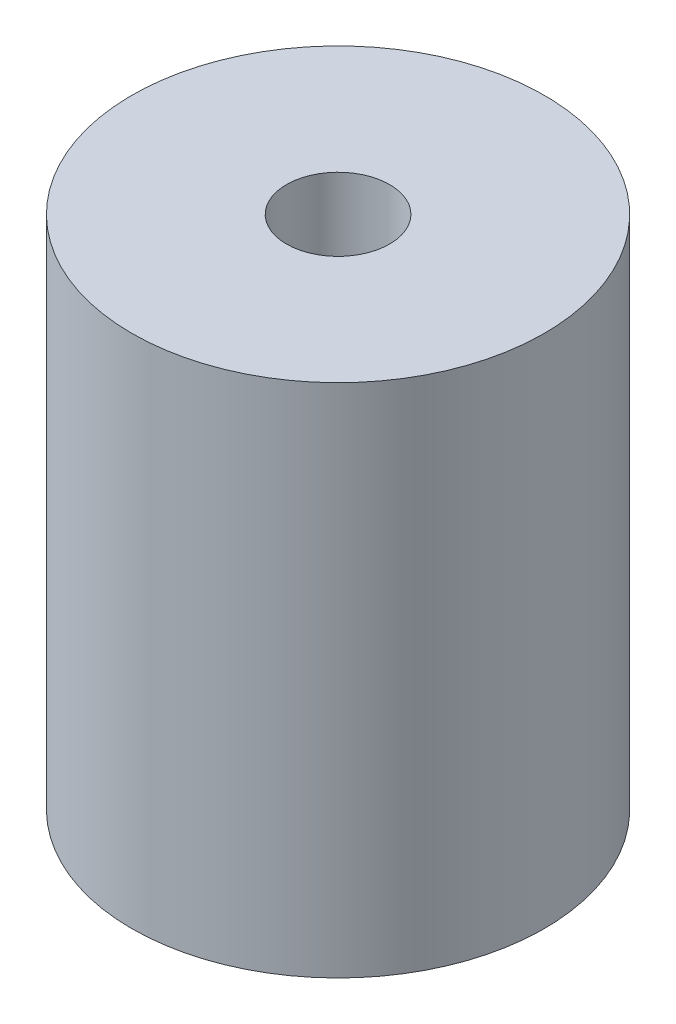
ISO-10303-21;
HEADER;
FILE_DESCRIPTION(('STEP AP214'),'2;1');
FILE_NAME('part.step','',(''),(''),'','','');
FILE_SCHEMA(('AUTOMOTIVE_DESIGN { 1 0 10303 214 1 1 1 1 }'));
ENDSEC;
DATA;
#1=APPLICATION_CONTEXT('core data for automotive mechanical design processes');
#2=APPLICATION_PROTOCOL_DEFINITION('international standard','automotive_design',2000,#1);
#3=PRODUCT_CONTEXT('',#1,'mechanical');
#4=PRODUCT('Part','Part','',(#3));
#5=PRODUCT_RELATED_PRODUCT_CATEGORY('part','',(#4));
#6=PRODUCT_DEFINITION_FORMATION('','',#4);
#7=PRODUCT_DEFINITION_CONTEXT('part definition',#1,'design');
#8=PRODUCT_DEFINITION('design','',#6,#7);
#9=PRODUCT_DEFINITION_SHAPE('','',#8);
#10=(LENGTH_UNIT() NAMED_UNIT(*) SI_UNIT(.MILLI.,.METRE.));
#11=(NAMED_UNIT(*) PLANE_ANGLE_UNIT() SI_UNIT($,.RADIAN.));
#12=(NAMED_UNIT(*) SI_UNIT($,.STERADIAN.) SOLID_ANGLE_UNIT());
#13=UNCERTAINTY_MEASURE_WITH_UNIT(LENGTH_MEASURE(1.E-05),#10,'distance_accuracy_value','');
#14=(GEOMETRIC_REPRESENTATION_CONTEXT(3) GLOBAL_UNCERTAINTY_ASSIGNED_CONTEXT((#13)) GLOBAL_UNIT_ASSIGNED_CONTEXT((#10,
#11,#12)) REPRESENTATION_CONTEXT('',''));
#15=CARTESIAN_POINT('',(0.,0.,0.));
#16=DIRECTION('',(0.,0.,1.));
#17=DIRECTION('',(1.,0.,0.));
#18=AXIS2_PLACEMENT_3D('',#15,#16,#17);
#19=CARTESIAN_POINT('',(0.,12.5,0.));
#20=DIRECTION('',(0.,-1.,0.));
#21=DIRECTION('',(0.,0.,-1.));
#22=AXIS2_PLACEMENT_3D('',#19,#20,#21);
#23=CYLINDRICAL_SURFACE('',#22,10.);
#24=CARTESIAN_POINT('',(0.,12.5,0.));
#25=DIRECTION('',(0.,1.,0.));
#26=DIRECTION('',(0.,0.,1.));
#27=AXIS2_PLACEMENT_3D('',#24,#25,#26);
#28=CIRCLE('',#27,10.);
#29=CARTESIAN_POINT('',(0.,12.5,10.));
#30=VERTEX_POINT('',#29);
#31=EDGE_CURVE('E10',#30,#30,#28,.T.);
#32=ORIENTED_EDGE('',*,*,#31,.F.);
#33=EDGE_LOOP('',(#32));
#34=FACE_BOUND('',#33,.T.);
#35=CARTESIAN_POINT('',(0.,-12.5,0.));
#36=DIRECTION('',(0.,1.,0.));
#37=DIRECTION('',(0.,0.,1.));
#38=AXIS2_PLACEMENT_3D('',#35,#36,#37);
#39=CIRCLE('',#38,10.);
#40=CARTESIAN_POINT('',(0.,-12.5,10.));
#41=VERTEX_POINT('',#40);
#42=EDGE_CURVE('E46',#41,#41,#39,.T.);
#43=ORIENTED_EDGE('',*,*,#42,.T.);
#44=EDGE_LOOP('',(#43));
#45=FACE_BOUND('',#44,.T.);
#46=ADVANCED_FACE('F43',(#34,#45),#23,.T.);
#47=CARTESIAN_POINT('',(0.,12.5,0.));
#48=DIRECTION('',(0.,1.,0.));
#49=DIRECTION('',(0.,0.,1.));
#50=AXIS2_PLACEMENT_3D('',#47,#48,#49);
#51=PLANE('',#50);
#52=CARTESIAN_POINT('',(0.,12.5,0.));
#53=DIRECTION('',(0.,1.,0.));
#54=DIRECTION('',(0.,0.,1.));
#55=AXIS2_PLACEMENT_3D('',#52,#53,#54);
#56=CIRCLE('',#55,2.5);
#57=CARTESIAN_POINT('',(0.,12.5,2.5));
#58=VERTEX_POINT('',#57);
#59=EDGE_CURVE('E55',#58,#58,#56,.T.);
#60=ORIENTED_EDGE('',*,*,#59,.F.);
#61=EDGE_LOOP('',(#60));
#62=FACE_BOUND('',#61,.T.);
#63=ORIENTED_EDGE('',*,*,#31,.T.);
#64=EDGE_LOOP('',(#63));
#65=FACE_BOUND('',#64,.T.);
#66=ADVANCED_FACE('F80',(#62,#65),#51,.T.);
#67=CARTESIAN_POINT('',(0.,-12.5,0.));
#68=DIRECTION('',(0.,1.,0.));
#69=DIRECTION('',(0.,0.,1.));
#70=AXIS2_PLACEMENT_3D('',#67,#68,#69);
#71=PLANE('',#70);
#72=CARTESIAN_POINT('',(0.,-12.5,0.));
#73=DIRECTION('',(0.,-1.,0.));
#74=DIRECTION('',(0.,0.,-1.));
#75=AXIS2_PLACEMENT_3D('',#72,#73,#74);
#76=CIRCLE('',#75,4.);
#77=CARTESIAN_POINT('',(0.,-12.5,-4.));
#78=VERTEX_POINT('',#77);
#79=EDGE_CURVE('E68',#78,#78,#76,.T.);
#80=ORIENTED_EDGE('',*,*,#79,.F.);
#81=EDGE_LOOP('',(#80));
#82=FACE_BOUND('',#81,.T.);
#83=ORIENTED_EDGE('',*,*,#42,.F.);
#84=EDGE_LOOP('',(#83));
#85=FACE_BOUND('',#84,.T.);
#86=ADVANCED_FACE('F76',(#82,#85),#71,.F.);
#87=CARTESIAN_POINT('',(0.,12.5,0.));
#88=DIRECTION('',(0.,-1.,0.));
#89=DIRECTION('',(0.,0.,-1.));
#90=AXIS2_PLACEMENT_3D('',#87,#88,#89);
#91=CYLINDRICAL_SURFACE('',#90,2.5);
#92=ORIENTED_EDGE('',*,*,#59,.T.);
#93=EDGE_LOOP('',(#92));
#94=FACE_BOUND('',#93,.T.);
#95=CARTESIAN_POINT('',(0.,0.,0.));
#96=DIRECTION('',(0.,1.,0.));
#97=DIRECTION('',(0.,0.,1.));
#98=AXIS2_PLACEMENT_3D('',#95,#96,#97);
#99=CIRCLE('',#98,2.5);
#100=CARTESIAN_POINT('',(0.,0.,2.5));
#101=VERTEX_POINT('',#100);
#102=EDGE_CURVE('E57',#101,#101,#99,.T.);
#103=ORIENTED_EDGE('',*,*,#102,.F.);
#104=EDGE_LOOP('',(#103));
#105=FACE_BOUND('',#104,.T.);
#106=ADVANCED_FACE('F79',(#94,#105),#91,.F.);
#107=CARTESIAN_POINT('',(0.,0.,0.));
#108=DIRECTION('',(0.,1.,0.));
#109=DIRECTION('',(0.,0.,1.));
#110=AXIS2_PLACEMENT_3D('',#107,#108,#109);
#111=PLANE('',#110);
#112=ORIENTED_EDGE('',*,*,#102,.T.);
#113=EDGE_LOOP('',(#112));
#114=FACE_BOUND('',#113,.T.);
#115=CARTESIAN_POINT('',(0.,0.,0.));
#116=DIRECTION('',(0.,1.,0.));
#117=DIRECTION('',(0.,0.,1.));
#118=AXIS2_PLACEMENT_3D('',#115,#116,#117);
#119=CIRCLE('',#118,4.);
#120=CARTESIAN_POINT('',(0.,0.,4.));
#121=VERTEX_POINT('',#120);
#122=EDGE_CURVE('E61',#121,#121,#119,.F.);
#123=ORIENTED_EDGE('',*,*,#122,.T.);
#124=EDGE_LOOP('',(#123));
#125=FACE_BOUND('',#124,.T.);
#126=ADVANCED_FACE('F96',(#114,#125),#111,.F.);
#127=CARTESIAN_POINT('',(0.,11.3137084989848,0.));
#128=DIRECTION('',(0.,-1.,0.));
#129=DIRECTION('',(0.,0.,-1.));
#130=AXIS2_PLACEMENT_3D('',#127,#128,#129);
#131=CYLINDRICAL_SURFACE('',#130,4.);
#132=ORIENTED_EDGE('',*,*,#79,.T.);
#133=EDGE_LOOP('',(#132));
#134=FACE_BOUND('',#133,.T.);
#135=ORIENTED_EDGE('',*,*,#122,.F.);
#136=EDGE_LOOP('',(#135));
#137=FACE_BOUND('',#136,.T.);
#138=ADVANCED_FACE('F73',(#134,#137),#131,.F.);
#139=CLOSED_SHELL('',(#46,#66,#86,#106,#126,#138));
#140=MANIFOLD_SOLID_BREP('B2',#139);
#141=ADVANCED_BREP_SHAPE_REPRESENTATION('',(#18,#140),#14);
#142=SHAPE_DEFINITION_REPRESENTATION(#9,#141);
ENDSEC;
END-ISO-10303-21;
